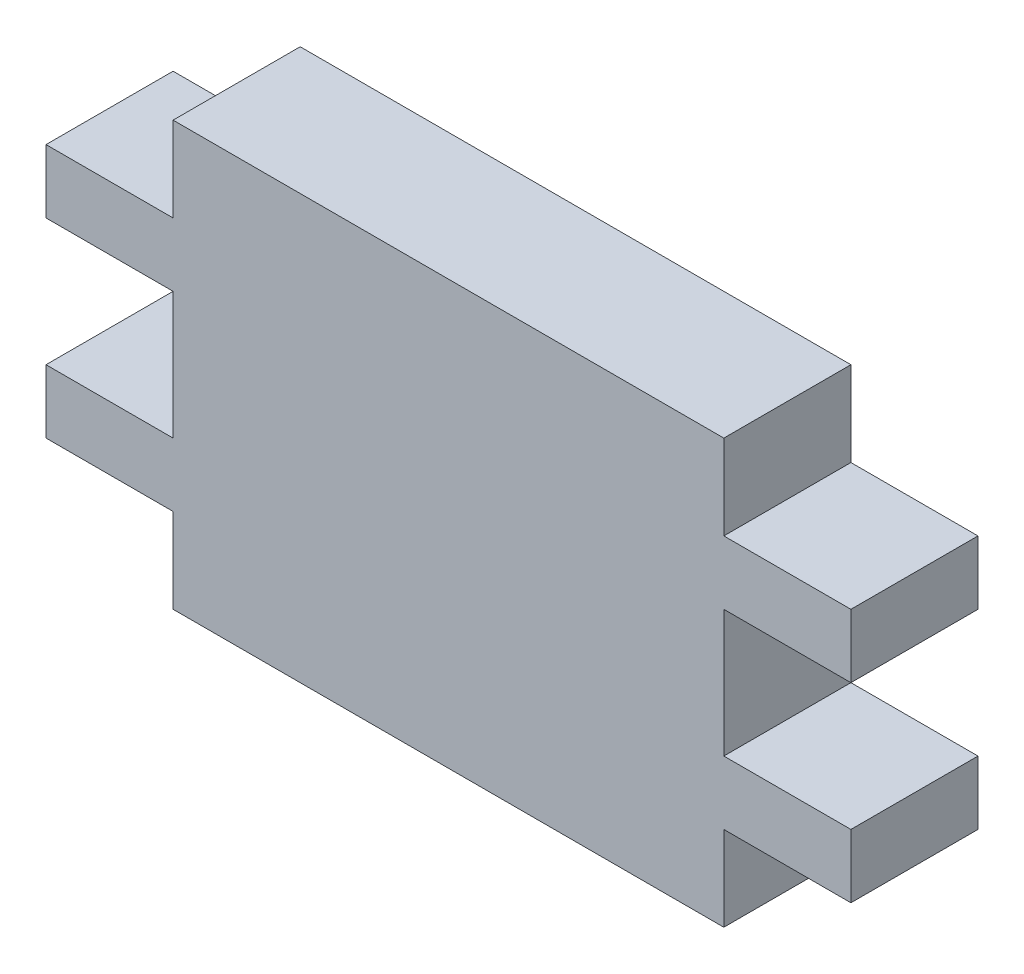
ISO-10303-21;
HEADER;
FILE_DESCRIPTION(('STEP AP214'),'2;1');
FILE_NAME('part.step','',(''),(''),'','','');
FILE_SCHEMA(('AUTOMOTIVE_DESIGN { 1 0 10303 214 1 1 1 1 }'));
ENDSEC;
DATA;
#1=APPLICATION_CONTEXT('core data for automotive mechanical design processes');
#2=APPLICATION_PROTOCOL_DEFINITION('international standard','automotive_design',2000,#1);
#3=PRODUCT_CONTEXT('',#1,'mechanical');
#4=PRODUCT('Part','Part','',(#3));
#5=PRODUCT_RELATED_PRODUCT_CATEGORY('part','',(#4));
#6=PRODUCT_DEFINITION_FORMATION('','',#4);
#7=PRODUCT_DEFINITION_CONTEXT('part definition',#1,'design');
#8=PRODUCT_DEFINITION('design','',#6,#7);
#9=PRODUCT_DEFINITION_SHAPE('','',#8);
#10=(LENGTH_UNIT() NAMED_UNIT(*) SI_UNIT(.MILLI.,.METRE.));
#11=(NAMED_UNIT(*) PLANE_ANGLE_UNIT() SI_UNIT($,.RADIAN.));
#12=(NAMED_UNIT(*) SI_UNIT($,.STERADIAN.) SOLID_ANGLE_UNIT());
#13=UNCERTAINTY_MEASURE_WITH_UNIT(LENGTH_MEASURE(1.E-05),#10,'distance_accuracy_value','');
#14=(GEOMETRIC_REPRESENTATION_CONTEXT(3) GLOBAL_UNCERTAINTY_ASSIGNED_CONTEXT((#13)) GLOBAL_UNIT_ASSIGNED_CONTEXT((#10,
#11,#12)) REPRESENTATION_CONTEXT('',''));
#15=CARTESIAN_POINT('',(0.,0.,0.));
#16=DIRECTION('',(0.,0.,1.));
#17=DIRECTION('',(1.,0.,0.));
#18=AXIS2_PLACEMENT_3D('',#15,#16,#17);
#19=CARTESIAN_POINT('',(9.5,-5.,3.));
#20=DIRECTION('',(-1.,0.,0.));
#21=DIRECTION('',(0.,0.,1.));
#22=AXIS2_PLACEMENT_3D('',#19,#20,#21);
#23=PLANE('',#22);
#24=DIRECTION('',(0.,1.,0.));
#25=VECTOR('',#24,1.);
#26=CARTESIAN_POINT('',(9.5,-5.,0.));
#27=LINE('',#26,#25);
#28=CARTESIAN_POINT('',(9.5,-3.,0.));
#29=VERTEX_POINT('',#28);
#30=CARTESIAN_POINT('',(9.5,-1.5,0.));
#31=VERTEX_POINT('',#30);
#32=EDGE_CURVE('E322',#29,#31,#27,.T.);
#33=ORIENTED_EDGE('',*,*,#32,.T.);
#34=DIRECTION('',(0.,0.,1.));
#35=VECTOR('',#34,1.);
#36=CARTESIAN_POINT('',(9.5,-1.5,0.));
#37=LINE('',#36,#35);
#38=CARTESIAN_POINT('',(9.5,-1.5,3.));
#39=VERTEX_POINT('',#38);
#40=EDGE_CURVE('E218',#31,#39,#37,.T.);
#41=ORIENTED_EDGE('',*,*,#40,.T.);
#42=DIRECTION('',(0.,1.,0.));
#43=VECTOR('',#42,1.);
#44=CARTESIAN_POINT('',(9.5,-5.,3.));
#45=LINE('',#44,#43);
#46=CARTESIAN_POINT('',(9.5,-3.,3.));
#47=VERTEX_POINT('',#46);
#48=EDGE_CURVE('E315',#47,#39,#45,.T.);
#49=ORIENTED_EDGE('',*,*,#48,.F.);
#50=DIRECTION('',(0.,0.,1.));
#51=VECTOR('',#50,1.);
#52=CARTESIAN_POINT('',(9.5,-3.,0.));
#53=LINE('',#52,#51);
#54=EDGE_CURVE('E235',#29,#47,#53,.T.);
#55=ORIENTED_EDGE('',*,*,#54,.F.);
#56=EDGE_LOOP('',(#33,#41,#49,#55));
#57=FACE_BOUND('',#56,.T.);
#58=ADVANCED_FACE('F39',(#57),#23,.F.);
#59=CARTESIAN_POINT('',(-9.5,-5.,3.));
#60=DIRECTION('',(1.,0.,0.));
#61=DIRECTION('',(0.,0.,-1.));
#62=AXIS2_PLACEMENT_3D('',#59,#60,#61);
#63=PLANE('',#62);
#64=DIRECTION('',(0.,-1.,0.));
#65=VECTOR('',#64,1.);
#66=CARTESIAN_POINT('',(-9.5,-5.,3.));
#67=LINE('',#66,#65);
#68=CARTESIAN_POINT('',(-9.5,3.,3.));
#69=VERTEX_POINT('',#68);
#70=CARTESIAN_POINT('',(-9.5,1.5,3.));
#71=VERTEX_POINT('',#70);
#72=EDGE_CURVE('E48',#69,#71,#67,.T.);
#73=ORIENTED_EDGE('',*,*,#72,.F.);
#74=DIRECTION('',(0.,0.,1.));
#75=VECTOR('',#74,1.);
#76=CARTESIAN_POINT('',(-9.5,3.,0.));
#77=LINE('',#76,#75);
#78=CARTESIAN_POINT('',(-9.5,3.,0.));
#79=VERTEX_POINT('',#78);
#80=EDGE_CURVE('E256',#79,#69,#77,.T.);
#81=ORIENTED_EDGE('',*,*,#80,.F.);
#82=DIRECTION('',(0.,-1.,0.));
#83=VECTOR('',#82,1.);
#84=CARTESIAN_POINT('',(-9.5,-5.,0.));
#85=LINE('',#84,#83);
#86=CARTESIAN_POINT('',(-9.5,1.5,0.));
#87=VERTEX_POINT('',#86);
#88=EDGE_CURVE('E325',#79,#87,#85,.T.);
#89=ORIENTED_EDGE('',*,*,#88,.T.);
#90=DIRECTION('',(0.,0.,1.));
#91=VECTOR('',#90,1.);
#92=CARTESIAN_POINT('',(-9.5,1.5,0.));
#93=LINE('',#92,#91);
#94=EDGE_CURVE('E277',#87,#71,#93,.T.);
#95=ORIENTED_EDGE('',*,*,#94,.T.);
#96=EDGE_LOOP('',(#73,#81,#89,#95));
#97=FACE_BOUND('',#96,.T.);
#98=ADVANCED_FACE('F370',(#97),#63,.F.);
#99=CARTESIAN_POINT('',(9.5,1.5,0.));
#100=VERTEX_POINT('',#99);
#101=CARTESIAN_POINT('',(9.5,3.,0.));
#102=VERTEX_POINT('',#101);
#103=EDGE_CURVE('E266',#100,#102,#27,.T.);
#104=ORIENTED_EDGE('',*,*,#103,.T.);
#105=DIRECTION('',(0.,0.,1.));
#106=VECTOR('',#105,1.);
#107=CARTESIAN_POINT('',(9.5,3.,0.));
#108=LINE('',#107,#106);
#109=CARTESIAN_POINT('',(9.5,3.,3.));
#110=VERTEX_POINT('',#109);
#111=EDGE_CURVE('E187',#102,#110,#108,.T.);
#112=ORIENTED_EDGE('',*,*,#111,.T.);
#113=CARTESIAN_POINT('',(9.5,1.5,3.));
#114=VERTEX_POINT('',#113);
#115=EDGE_CURVE('E312',#114,#110,#45,.T.);
#116=ORIENTED_EDGE('',*,*,#115,.F.);
#117=DIRECTION('',(0.,0.,1.));
#118=VECTOR('',#117,1.);
#119=CARTESIAN_POINT('',(9.5,1.5,0.));
#120=LINE('',#119,#118);
#121=EDGE_CURVE('E211',#100,#114,#120,.T.);
#122=ORIENTED_EDGE('',*,*,#121,.F.);
#123=EDGE_LOOP('',(#104,#112,#116,#122));
#124=FACE_BOUND('',#123,.T.);
#125=ADVANCED_FACE('F41',(#124),#23,.F.);
#126=CARTESIAN_POINT('',(-9.5,5.,3.));
#127=DIRECTION('',(0.,-1.,0.));
#128=DIRECTION('',(0.,0.,-1.));
#129=AXIS2_PLACEMENT_3D('',#126,#127,#128);
#130=PLANE('',#129);
#131=DIRECTION('',(-1.,0.,0.));
#132=VECTOR('',#131,1.);
#133=CARTESIAN_POINT('',(-9.5,5.,3.));
#134=LINE('',#133,#132);
#135=CARTESIAN_POINT('',(6.5,5.,3.));
#136=VERTEX_POINT('',#135);
#137=CARTESIAN_POINT('',(-6.5,5.,3.));
#138=VERTEX_POINT('',#137);
#139=EDGE_CURVE('E316',#136,#138,#134,.T.);
#140=ORIENTED_EDGE('',*,*,#139,.F.);
#141=DIRECTION('',(0.,0.,1.));
#142=VECTOR('',#141,1.);
#143=CARTESIAN_POINT('',(6.5,5.,0.));
#144=LINE('',#143,#142);
#145=CARTESIAN_POINT('',(6.5,5.,0.));
#146=VERTEX_POINT('',#145);
#147=EDGE_CURVE('E207',#146,#136,#144,.T.);
#148=ORIENTED_EDGE('',*,*,#147,.F.);
#149=DIRECTION('',(-1.,0.,0.));
#150=VECTOR('',#149,1.);
#151=CARTESIAN_POINT('',(-9.5,5.,0.));
#152=LINE('',#151,#150);
#153=CARTESIAN_POINT('',(-6.5,5.,0.));
#154=VERTEX_POINT('',#153);
#155=EDGE_CURVE('E200',#146,#154,#152,.T.);
#156=ORIENTED_EDGE('',*,*,#155,.T.);
#157=DIRECTION('',(0.,0.,1.));
#158=VECTOR('',#157,1.);
#159=CARTESIAN_POINT('',(-6.5,5.,0.));
#160=LINE('',#159,#158);
#161=EDGE_CURVE('E263',#154,#138,#160,.T.);
#162=ORIENTED_EDGE('',*,*,#161,.T.);
#163=EDGE_LOOP('',(#140,#148,#156,#162));
#164=FACE_BOUND('',#163,.T.);
#165=ADVANCED_FACE('F377',(#164),#130,.F.);
#166=CARTESIAN_POINT('',(-9.5,-1.5,3.));
#167=VERTEX_POINT('',#166);
#168=CARTESIAN_POINT('',(-9.5,-3.,3.));
#169=VERTEX_POINT('',#168);
#170=EDGE_CURVE('E318',#167,#169,#67,.T.);
#171=ORIENTED_EDGE('',*,*,#170,.F.);
#172=DIRECTION('',(0.,0.,1.));
#173=VECTOR('',#172,1.);
#174=CARTESIAN_POINT('',(-9.5,-1.5,0.));
#175=LINE('',#174,#173);
#176=CARTESIAN_POINT('',(-9.5,-1.5,0.));
#177=VERTEX_POINT('',#176);
#178=EDGE_CURVE('E270',#177,#167,#175,.T.);
#179=ORIENTED_EDGE('',*,*,#178,.F.);
#180=CARTESIAN_POINT('',(-9.5,-3.,0.));
#181=VERTEX_POINT('',#180);
#182=EDGE_CURVE('E323',#177,#181,#85,.T.);
#183=ORIENTED_EDGE('',*,*,#182,.T.);
#184=DIRECTION('',(0.,0.,1.));
#185=VECTOR('',#184,1.);
#186=CARTESIAN_POINT('',(-9.5,-3.,0.));
#187=LINE('',#186,#185);
#188=EDGE_CURVE('E209',#181,#169,#187,.T.);
#189=ORIENTED_EDGE('',*,*,#188,.T.);
#190=EDGE_LOOP('',(#171,#179,#183,#189));
#191=FACE_BOUND('',#190,.T.);
#192=ADVANCED_FACE('F376',(#191),#63,.F.);
#193=CARTESIAN_POINT('',(-9.5,-5.,3.));
#194=DIRECTION('',(0.,1.,0.));
#195=DIRECTION('',(0.,0.,1.));
#196=AXIS2_PLACEMENT_3D('',#193,#194,#195);
#197=PLANE('',#196);
#198=DIRECTION('',(1.,0.,0.));
#199=VECTOR('',#198,1.);
#200=CARTESIAN_POINT('',(-9.5,-5.,0.));
#201=LINE('',#200,#199);
#202=CARTESIAN_POINT('',(-6.5,-5.,0.));
#203=VERTEX_POINT('',#202);
#204=CARTESIAN_POINT('',(6.5,-5.,0.));
#205=VERTEX_POINT('',#204);
#206=EDGE_CURVE('E43',#203,#205,#201,.T.);
#207=ORIENTED_EDGE('',*,*,#206,.T.);
#208=DIRECTION('',(0.,0.,1.));
#209=VECTOR('',#208,1.);
#210=CARTESIAN_POINT('',(6.5,-5.,0.));
#211=LINE('',#210,#209);
#212=CARTESIAN_POINT('',(6.5,-5.,3.));
#213=VERTEX_POINT('',#212);
#214=EDGE_CURVE('E239',#205,#213,#211,.T.);
#215=ORIENTED_EDGE('',*,*,#214,.T.);
#216=DIRECTION('',(1.,0.,0.));
#217=VECTOR('',#216,1.);
#218=CARTESIAN_POINT('',(-9.5,-5.,3.));
#219=LINE('',#218,#217);
#220=CARTESIAN_POINT('',(-6.5,-5.,3.));
#221=VERTEX_POINT('',#220);
#222=EDGE_CURVE('E11',#221,#213,#219,.T.);
#223=ORIENTED_EDGE('',*,*,#222,.F.);
#224=DIRECTION('',(0.,0.,1.));
#225=VECTOR('',#224,1.);
#226=CARTESIAN_POINT('',(-6.5,-5.,0.));
#227=LINE('',#226,#225);
#228=EDGE_CURVE('E296',#203,#221,#227,.T.);
#229=ORIENTED_EDGE('',*,*,#228,.F.);
#230=EDGE_LOOP('',(#207,#215,#223,#229));
#231=FACE_BOUND('',#230,.T.);
#232=ADVANCED_FACE('F337',(#231),#197,.F.);
#233=CARTESIAN_POINT('',(0.,0.,3.));
#234=DIRECTION('',(0.,0.,-1.));
#235=DIRECTION('',(-1.,0.,0.));
#236=AXIS2_PLACEMENT_3D('',#233,#234,#235);
#237=PLANE('',#236);
#238=DIRECTION('',(1.,0.,0.));
#239=VECTOR('',#238,1.);
#240=CARTESIAN_POINT('',(6.5,3.,3.));
#241=LINE('',#240,#239);
#242=CARTESIAN_POINT('',(6.5,3.,3.));
#243=VERTEX_POINT('',#242);
#244=EDGE_CURVE('E201',#243,#110,#241,.T.);
#245=ORIENTED_EDGE('',*,*,#244,.F.);
#246=DIRECTION('',(0.,-1.,0.));
#247=VECTOR('',#246,1.);
#248=CARTESIAN_POINT('',(6.5,5.,3.));
#249=LINE('',#248,#247);
#250=EDGE_CURVE('E184',#136,#243,#249,.T.);
#251=ORIENTED_EDGE('',*,*,#250,.F.);
#252=ORIENTED_EDGE('',*,*,#139,.T.);
#253=DIRECTION('',(0.,1.,0.));
#254=VECTOR('',#253,1.);
#255=CARTESIAN_POINT('',(-6.5,3.,3.));
#256=LINE('',#255,#254);
#257=CARTESIAN_POINT('',(-6.5,3.,3.));
#258=VERTEX_POINT('',#257);
#259=EDGE_CURVE('E254',#258,#138,#256,.T.);
#260=ORIENTED_EDGE('',*,*,#259,.F.);
#261=DIRECTION('',(1.,0.,0.));
#262=VECTOR('',#261,1.);
#263=CARTESIAN_POINT('',(-9.5,3.,3.));
#264=LINE('',#263,#262);
#265=EDGE_CURVE('E257',#69,#258,#264,.T.);
#266=ORIENTED_EDGE('',*,*,#265,.F.);
#267=ORIENTED_EDGE('',*,*,#72,.T.);
#268=DIRECTION('',(-1.,0.,0.));
#269=VECTOR('',#268,1.);
#270=CARTESIAN_POINT('',(-9.5,1.5,3.));
#271=LINE('',#270,#269);
#272=CARTESIAN_POINT('',(-6.5,1.5,3.));
#273=VERTEX_POINT('',#272);
#274=EDGE_CURVE('E281',#273,#71,#271,.T.);
#275=ORIENTED_EDGE('',*,*,#274,.F.);
#276=DIRECTION('',(0.,1.,0.));
#277=VECTOR('',#276,1.);
#278=CARTESIAN_POINT('',(-6.5,1.5,3.));
#279=LINE('',#278,#277);
#280=CARTESIAN_POINT('',(-6.5,-1.5,3.));
#281=VERTEX_POINT('',#280);
#282=EDGE_CURVE('E283',#281,#273,#279,.T.);
#283=ORIENTED_EDGE('',*,*,#282,.F.);
#284=DIRECTION('',(1.,0.,0.));
#285=VECTOR('',#284,1.);
#286=CARTESIAN_POINT('',(-9.5,-1.5,3.));
#287=LINE('',#286,#285);
#288=EDGE_CURVE('E260',#167,#281,#287,.T.);
#289=ORIENTED_EDGE('',*,*,#288,.F.);
#290=ORIENTED_EDGE('',*,*,#170,.T.);
#291=DIRECTION('',(-1.,0.,0.));
#292=VECTOR('',#291,1.);
#293=CARTESIAN_POINT('',(-9.5,-3.,3.));
#294=LINE('',#293,#292);
#295=CARTESIAN_POINT('',(-6.5,-3.,3.));
#296=VERTEX_POINT('',#295);
#297=EDGE_CURVE('E303',#296,#169,#294,.T.);
#298=ORIENTED_EDGE('',*,*,#297,.F.);
#299=DIRECTION('',(0.,1.,0.));
#300=VECTOR('',#299,1.);
#301=CARTESIAN_POINT('',(-6.5,-3.,3.));
#302=LINE('',#301,#300);
#303=EDGE_CURVE('E280',#221,#296,#302,.T.);
#304=ORIENTED_EDGE('',*,*,#303,.F.);
#305=ORIENTED_EDGE('',*,*,#222,.T.);
#306=DIRECTION('',(0.,-1.,0.));
#307=VECTOR('',#306,1.);
#308=CARTESIAN_POINT('',(6.5,-3.,3.));
#309=LINE('',#308,#307);
#310=CARTESIAN_POINT('',(6.5,-3.,3.));
#311=VERTEX_POINT('',#310);
#312=EDGE_CURVE('E242',#311,#213,#309,.T.);
#313=ORIENTED_EDGE('',*,*,#312,.F.);
#314=DIRECTION('',(-1.,0.,0.));
#315=VECTOR('',#314,1.);
#316=CARTESIAN_POINT('',(9.5,-3.,3.));
#317=LINE('',#316,#315);
#318=EDGE_CURVE('E221',#47,#311,#317,.T.);
#319=ORIENTED_EDGE('',*,*,#318,.F.);
#320=ORIENTED_EDGE('',*,*,#48,.T.);
#321=DIRECTION('',(1.,0.,0.));
#322=VECTOR('',#321,1.);
#323=CARTESIAN_POINT('',(9.5,-1.5,3.));
#324=LINE('',#323,#322);
#325=CARTESIAN_POINT('',(6.5,-1.5,3.));
#326=VERTEX_POINT('',#325);
#327=EDGE_CURVE('E222',#326,#39,#324,.T.);
#328=ORIENTED_EDGE('',*,*,#327,.F.);
#329=DIRECTION('',(0.,-1.,0.));
#330=VECTOR('',#329,1.);
#331=CARTESIAN_POINT('',(6.5,1.5,3.));
#332=LINE('',#331,#330);
#333=CARTESIAN_POINT('',(6.5,1.5,3.));
#334=VERTEX_POINT('',#333);
#335=EDGE_CURVE('E224',#334,#326,#332,.T.);
#336=ORIENTED_EDGE('',*,*,#335,.F.);
#337=DIRECTION('',(-1.,0.,0.));
#338=VECTOR('',#337,1.);
#339=CARTESIAN_POINT('',(9.5,1.5,3.));
#340=LINE('',#339,#338);
#341=EDGE_CURVE('E205',#114,#334,#340,.T.);
#342=ORIENTED_EDGE('',*,*,#341,.F.);
#343=ORIENTED_EDGE('',*,*,#115,.T.);
#344=EDGE_LOOP('',(#245,#251,#252,#260,#266,#267,#275,#283,#289,#290,#298,#304,#305,#313,#319,
#320,#328,#336,#342,#343));
#345=FACE_BOUND('',#344,.T.);
#346=ADVANCED_FACE('F350',(#345),#237,.F.);
#347=CARTESIAN_POINT('',(0.,0.,0.));
#348=DIRECTION('',(0.,0.,-1.));
#349=DIRECTION('',(-1.,0.,0.));
#350=AXIS2_PLACEMENT_3D('',#347,#348,#349);
#351=PLANE('',#350);
#352=DIRECTION('',(0.,-1.,0.));
#353=VECTOR('',#352,1.);
#354=CARTESIAN_POINT('',(6.5,5.,0.));
#355=LINE('',#354,#353);
#356=CARTESIAN_POINT('',(6.5,3.,0.));
#357=VERTEX_POINT('',#356);
#358=EDGE_CURVE('E181',#146,#357,#355,.T.);
#359=ORIENTED_EDGE('',*,*,#358,.T.);
#360=DIRECTION('',(1.,0.,0.));
#361=VECTOR('',#360,1.);
#362=CARTESIAN_POINT('',(6.5,3.,0.));
#363=LINE('',#362,#361);
#364=EDGE_CURVE('E188',#357,#102,#363,.T.);
#365=ORIENTED_EDGE('',*,*,#364,.T.);
#366=ORIENTED_EDGE('',*,*,#103,.F.);
#367=DIRECTION('',(-1.,0.,0.));
#368=VECTOR('',#367,1.);
#369=CARTESIAN_POINT('',(9.5,1.5,0.));
#370=LINE('',#369,#368);
#371=CARTESIAN_POINT('',(6.5,1.5,0.));
#372=VERTEX_POINT('',#371);
#373=EDGE_CURVE('E225',#100,#372,#370,.T.);
#374=ORIENTED_EDGE('',*,*,#373,.T.);
#375=DIRECTION('',(0.,-1.,0.));
#376=VECTOR('',#375,1.);
#377=CARTESIAN_POINT('',(6.5,1.5,0.));
#378=LINE('',#377,#376);
#379=CARTESIAN_POINT('',(6.5,-1.5,0.));
#380=VERTEX_POINT('',#379);
#381=EDGE_CURVE('E56',#372,#380,#378,.T.);
#382=ORIENTED_EDGE('',*,*,#381,.T.);
#383=DIRECTION('',(1.,0.,0.));
#384=VECTOR('',#383,1.);
#385=CARTESIAN_POINT('',(9.5,-1.5,0.));
#386=LINE('',#385,#384);
#387=EDGE_CURVE('E213',#380,#31,#386,.T.);
#388=ORIENTED_EDGE('',*,*,#387,.T.);
#389=ORIENTED_EDGE('',*,*,#32,.F.);
#390=DIRECTION('',(-1.,0.,0.));
#391=VECTOR('',#390,1.);
#392=CARTESIAN_POINT('',(9.5,-3.,0.));
#393=LINE('',#392,#391);
#394=CARTESIAN_POINT('',(6.5,-3.,0.));
#395=VERTEX_POINT('',#394);
#396=EDGE_CURVE('E244',#29,#395,#393,.T.);
#397=ORIENTED_EDGE('',*,*,#396,.T.);
#398=DIRECTION('',(0.,-1.,0.));
#399=VECTOR('',#398,1.);
#400=CARTESIAN_POINT('',(6.5,-3.,0.));
#401=LINE('',#400,#399);
#402=EDGE_CURVE('E64',#395,#205,#401,.T.);
#403=ORIENTED_EDGE('',*,*,#402,.T.);
#404=ORIENTED_EDGE('',*,*,#206,.F.);
#405=DIRECTION('',(0.,1.,0.));
#406=VECTOR('',#405,1.);
#407=CARTESIAN_POINT('',(-6.5,-3.,0.));
#408=LINE('',#407,#406);
#409=CARTESIAN_POINT('',(-6.5,-3.,0.));
#410=VERTEX_POINT('',#409);
#411=EDGE_CURVE('E305',#203,#410,#408,.T.);
#412=ORIENTED_EDGE('',*,*,#411,.T.);
#413=DIRECTION('',(-1.,0.,0.));
#414=VECTOR('',#413,1.);
#415=CARTESIAN_POINT('',(-9.5,-3.,0.));
#416=LINE('',#415,#414);
#417=EDGE_CURVE('E298',#410,#181,#416,.T.);
#418=ORIENTED_EDGE('',*,*,#417,.T.);
#419=ORIENTED_EDGE('',*,*,#182,.F.);
#420=DIRECTION('',(1.,0.,0.));
#421=VECTOR('',#420,1.);
#422=CARTESIAN_POINT('',(-9.5,-1.5,0.));
#423=LINE('',#422,#421);
#424=CARTESIAN_POINT('',(-6.5,-1.5,0.));
#425=VERTEX_POINT('',#424);
#426=EDGE_CURVE('E284',#177,#425,#423,.T.);
#427=ORIENTED_EDGE('',*,*,#426,.T.);
#428=DIRECTION('',(0.,1.,0.));
#429=VECTOR('',#428,1.);
#430=CARTESIAN_POINT('',(-6.5,1.5,0.));
#431=LINE('',#430,#429);
#432=CARTESIAN_POINT('',(-6.5,1.5,0.));
#433=VERTEX_POINT('',#432);
#434=EDGE_CURVE('E291',#425,#433,#431,.T.);
#435=ORIENTED_EDGE('',*,*,#434,.T.);
#436=DIRECTION('',(-1.,0.,0.));
#437=VECTOR('',#436,1.);
#438=CARTESIAN_POINT('',(-9.5,1.5,0.));
#439=LINE('',#438,#437);
#440=EDGE_CURVE('E272',#433,#87,#439,.T.);
#441=ORIENTED_EDGE('',*,*,#440,.T.);
#442=ORIENTED_EDGE('',*,*,#88,.F.);
#443=DIRECTION('',(1.,0.,0.));
#444=VECTOR('',#443,1.);
#445=CARTESIAN_POINT('',(-9.5,3.,0.));
#446=LINE('',#445,#444);
#447=CARTESIAN_POINT('',(-6.5,3.,0.));
#448=VERTEX_POINT('',#447);
#449=EDGE_CURVE('E250',#79,#448,#446,.T.);
#450=ORIENTED_EDGE('',*,*,#449,.T.);
#451=DIRECTION('',(0.,1.,0.));
#452=VECTOR('',#451,1.);
#453=CARTESIAN_POINT('',(-6.5,3.,0.));
#454=LINE('',#453,#452);
#455=EDGE_CURVE('E253',#448,#154,#454,.T.);
#456=ORIENTED_EDGE('',*,*,#455,.T.);
#457=ORIENTED_EDGE('',*,*,#155,.F.);
#458=EDGE_LOOP('',(#359,#365,#366,#374,#382,#388,#389,#397,#403,#404,#412,#418,#419,#427,#435,
#441,#442,#450,#456,#457));
#459=FACE_BOUND('',#458,.T.);
#460=ADVANCED_FACE('F198',(#459),#351,.T.);
#461=CARTESIAN_POINT('',(-9.5,-3.,0.));
#462=DIRECTION('',(0.,1.,0.));
#463=DIRECTION('',(0.,0.,1.));
#464=AXIS2_PLACEMENT_3D('',#461,#462,#463);
#465=PLANE('',#464);
#466=ORIENTED_EDGE('',*,*,#297,.T.);
#467=ORIENTED_EDGE('',*,*,#188,.F.);
#468=ORIENTED_EDGE('',*,*,#417,.F.);
#469=DIRECTION('',(0.,0.,1.));
#470=VECTOR('',#469,1.);
#471=CARTESIAN_POINT('',(-6.5,-3.,0.));
#472=LINE('',#471,#470);
#473=EDGE_CURVE('E299',#410,#296,#472,.T.);
#474=ORIENTED_EDGE('',*,*,#473,.T.);
#475=EDGE_LOOP('',(#466,#467,#468,#474));
#476=FACE_BOUND('',#475,.T.);
#477=ADVANCED_FACE('F412',(#476),#465,.F.);
#478=CARTESIAN_POINT('',(-6.5,-3.,0.));
#479=DIRECTION('',(1.,0.,0.));
#480=DIRECTION('',(0.,1.,0.));
#481=AXIS2_PLACEMENT_3D('',#478,#479,#480);
#482=PLANE('',#481);
#483=ORIENTED_EDGE('',*,*,#303,.T.);
#484=ORIENTED_EDGE('',*,*,#473,.F.);
#485=ORIENTED_EDGE('',*,*,#411,.F.);
#486=ORIENTED_EDGE('',*,*,#228,.T.);
#487=EDGE_LOOP('',(#483,#484,#485,#486));
#488=FACE_BOUND('',#487,.T.);
#489=ADVANCED_FACE('F415',(#488),#482,.F.);
#490=CARTESIAN_POINT('',(-9.5,1.5,0.));
#491=DIRECTION('',(0.,1.,0.));
#492=DIRECTION('',(0.,0.,1.));
#493=AXIS2_PLACEMENT_3D('',#490,#491,#492);
#494=PLANE('',#493);
#495=ORIENTED_EDGE('',*,*,#274,.T.);
#496=ORIENTED_EDGE('',*,*,#94,.F.);
#497=ORIENTED_EDGE('',*,*,#440,.F.);
#498=DIRECTION('',(0.,0.,1.));
#499=VECTOR('',#498,1.);
#500=CARTESIAN_POINT('',(-6.5,1.5,0.));
#501=LINE('',#500,#499);
#502=EDGE_CURVE('E275',#433,#273,#501,.T.);
#503=ORIENTED_EDGE('',*,*,#502,.T.);
#504=EDGE_LOOP('',(#495,#496,#497,#503));
#505=FACE_BOUND('',#504,.T.);
#506=ADVANCED_FACE('F402',(#505),#494,.F.);
#507=CARTESIAN_POINT('',(-6.5,1.5,0.));
#508=DIRECTION('',(1.,0.,0.));
#509=DIRECTION('',(0.,0.,-1.));
#510=AXIS2_PLACEMENT_3D('',#507,#508,#509);
#511=PLANE('',#510);
#512=ORIENTED_EDGE('',*,*,#282,.T.);
#513=ORIENTED_EDGE('',*,*,#502,.F.);
#514=ORIENTED_EDGE('',*,*,#434,.F.);
#515=DIRECTION('',(0.,0.,1.));
#516=VECTOR('',#515,1.);
#517=CARTESIAN_POINT('',(-6.5,-1.5,0.));
#518=LINE('',#517,#516);
#519=EDGE_CURVE('E273',#425,#281,#518,.T.);
#520=ORIENTED_EDGE('',*,*,#519,.T.);
#521=EDGE_LOOP('',(#512,#513,#514,#520));
#522=FACE_BOUND('',#521,.T.);
#523=ADVANCED_FACE('F405',(#522),#511,.F.);
#524=CARTESIAN_POINT('',(-9.5,-1.5,0.));
#525=DIRECTION('',(0.,-1.,0.));
#526=DIRECTION('',(0.,0.,-1.));
#527=AXIS2_PLACEMENT_3D('',#524,#525,#526);
#528=PLANE('',#527);
#529=ORIENTED_EDGE('',*,*,#288,.T.);
#530=ORIENTED_EDGE('',*,*,#519,.F.);
#531=ORIENTED_EDGE('',*,*,#426,.F.);
#532=ORIENTED_EDGE('',*,*,#178,.T.);
#533=EDGE_LOOP('',(#529,#530,#531,#532));
#534=FACE_BOUND('',#533,.T.);
#535=ADVANCED_FACE('F408',(#534),#528,.F.);
#536=CARTESIAN_POINT('',(-6.5,3.,0.));
#537=DIRECTION('',(1.,0.,0.));
#538=DIRECTION('',(0.,0.,-1.));
#539=AXIS2_PLACEMENT_3D('',#536,#537,#538);
#540=PLANE('',#539);
#541=ORIENTED_EDGE('',*,*,#259,.T.);
#542=ORIENTED_EDGE('',*,*,#161,.F.);
#543=ORIENTED_EDGE('',*,*,#455,.F.);
#544=DIRECTION('',(0.,0.,1.));
#545=VECTOR('',#544,1.);
#546=CARTESIAN_POINT('',(-6.5,3.,0.));
#547=LINE('',#546,#545);
#548=EDGE_CURVE('E267',#448,#258,#547,.T.);
#549=ORIENTED_EDGE('',*,*,#548,.T.);
#550=EDGE_LOOP('',(#541,#542,#543,#549));
#551=FACE_BOUND('',#550,.T.);
#552=ADVANCED_FACE('F365',(#551),#540,.F.);
#553=CARTESIAN_POINT('',(-9.5,3.,0.));
#554=DIRECTION('',(0.,-1.,0.));
#555=DIRECTION('',(0.,0.,-1.));
#556=AXIS2_PLACEMENT_3D('',#553,#554,#555);
#557=PLANE('',#556);
#558=ORIENTED_EDGE('',*,*,#265,.T.);
#559=ORIENTED_EDGE('',*,*,#548,.F.);
#560=ORIENTED_EDGE('',*,*,#449,.F.);
#561=ORIENTED_EDGE('',*,*,#80,.T.);
#562=EDGE_LOOP('',(#558,#559,#560,#561));
#563=FACE_BOUND('',#562,.T.);
#564=ADVANCED_FACE('F356',(#563),#557,.F.);
#565=CARTESIAN_POINT('',(6.5,-3.,0.));
#566=DIRECTION('',(-1.,0.,0.));
#567=DIRECTION('',(0.,0.,1.));
#568=AXIS2_PLACEMENT_3D('',#565,#566,#567);
#569=PLANE('',#568);
#570=ORIENTED_EDGE('',*,*,#312,.T.);
#571=ORIENTED_EDGE('',*,*,#214,.F.);
#572=ORIENTED_EDGE('',*,*,#402,.F.);
#573=DIRECTION('',(0.,0.,1.));
#574=VECTOR('',#573,1.);
#575=CARTESIAN_POINT('',(6.5,-3.,0.));
#576=LINE('',#575,#574);
#577=EDGE_CURVE('E237',#395,#311,#576,.T.);
#578=ORIENTED_EDGE('',*,*,#577,.T.);
#579=EDGE_LOOP('',(#570,#571,#572,#578));
#580=FACE_BOUND('',#579,.T.);
#581=ADVANCED_FACE('F354',(#580),#569,.F.);
#582=CARTESIAN_POINT('',(9.5,-3.,0.));
#583=DIRECTION('',(0.,1.,0.));
#584=DIRECTION('',(-1.,0.,0.));
#585=AXIS2_PLACEMENT_3D('',#582,#583,#584);
#586=PLANE('',#585);
#587=ORIENTED_EDGE('',*,*,#318,.T.);
#588=ORIENTED_EDGE('',*,*,#577,.F.);
#589=ORIENTED_EDGE('',*,*,#396,.F.);
#590=ORIENTED_EDGE('',*,*,#54,.T.);
#591=EDGE_LOOP('',(#587,#588,#589,#590));
#592=FACE_BOUND('',#591,.T.);
#593=ADVANCED_FACE('F343',(#592),#586,.F.);
#594=CARTESIAN_POINT('',(9.5,-1.5,0.));
#595=DIRECTION('',(0.,-1.,0.));
#596=DIRECTION('',(1.,0.,0.));
#597=AXIS2_PLACEMENT_3D('',#594,#595,#596);
#598=PLANE('',#597);
#599=ORIENTED_EDGE('',*,*,#327,.T.);
#600=ORIENTED_EDGE('',*,*,#40,.F.);
#601=ORIENTED_EDGE('',*,*,#387,.F.);
#602=DIRECTION('',(0.,0.,1.));
#603=VECTOR('',#602,1.);
#604=CARTESIAN_POINT('',(6.5,-1.5,0.));
#605=LINE('',#604,#603);
#606=EDGE_CURVE('E216',#380,#326,#605,.T.);
#607=ORIENTED_EDGE('',*,*,#606,.T.);
#608=EDGE_LOOP('',(#599,#600,#601,#607));
#609=FACE_BOUND('',#608,.T.);
#610=ADVANCED_FACE('F362',(#609),#598,.F.);
#611=CARTESIAN_POINT('',(6.5,1.5,0.));
#612=DIRECTION('',(-1.,0.,0.));
#613=DIRECTION('',(0.,0.,1.));
#614=AXIS2_PLACEMENT_3D('',#611,#612,#613);
#615=PLANE('',#614);
#616=ORIENTED_EDGE('',*,*,#335,.T.);
#617=ORIENTED_EDGE('',*,*,#606,.F.);
#618=ORIENTED_EDGE('',*,*,#381,.F.);
#619=DIRECTION('',(0.,0.,1.));
#620=VECTOR('',#619,1.);
#621=CARTESIAN_POINT('',(6.5,1.5,0.));
#622=LINE('',#621,#620);
#623=EDGE_CURVE('E214',#372,#334,#622,.T.);
#624=ORIENTED_EDGE('',*,*,#623,.T.);
#625=EDGE_LOOP('',(#616,#617,#618,#624));
#626=FACE_BOUND('',#625,.T.);
#627=ADVANCED_FACE('F388',(#626),#615,.F.);
#628=CARTESIAN_POINT('',(9.5,1.5,0.));
#629=DIRECTION('',(0.,1.,0.));
#630=DIRECTION('',(-1.,0.,0.));
#631=AXIS2_PLACEMENT_3D('',#628,#629,#630);
#632=PLANE('',#631);
#633=ORIENTED_EDGE('',*,*,#341,.T.);
#634=ORIENTED_EDGE('',*,*,#623,.F.);
#635=ORIENTED_EDGE('',*,*,#373,.F.);
#636=ORIENTED_EDGE('',*,*,#121,.T.);
#637=EDGE_LOOP('',(#633,#634,#635,#636));
#638=FACE_BOUND('',#637,.T.);
#639=ADVANCED_FACE('F386',(#638),#632,.F.);
#640=CARTESIAN_POINT('',(6.5,5.,0.));
#641=DIRECTION('',(-1.,0.,0.));
#642=DIRECTION('',(0.,-1.,0.));
#643=AXIS2_PLACEMENT_3D('',#640,#641,#642);
#644=PLANE('',#643);
#645=ORIENTED_EDGE('',*,*,#250,.T.);
#646=DIRECTION('',(0.,0.,1.));
#647=VECTOR('',#646,1.);
#648=CARTESIAN_POINT('',(6.5,3.,0.));
#649=LINE('',#648,#647);
#650=EDGE_CURVE('E177',#357,#243,#649,.T.);
#651=ORIENTED_EDGE('',*,*,#650,.F.);
#652=ORIENTED_EDGE('',*,*,#358,.F.);
#653=ORIENTED_EDGE('',*,*,#147,.T.);
#654=EDGE_LOOP('',(#645,#651,#652,#653));
#655=FACE_BOUND('',#654,.T.);
#656=ADVANCED_FACE('F179',(#655),#644,.F.);
#657=CARTESIAN_POINT('',(6.5,3.,0.));
#658=DIRECTION('',(0.,-1.,0.));
#659=DIRECTION('',(0.,0.,-1.));
#660=AXIS2_PLACEMENT_3D('',#657,#658,#659);
#661=PLANE('',#660);
#662=ORIENTED_EDGE('',*,*,#244,.T.);
#663=ORIENTED_EDGE('',*,*,#111,.F.);
#664=ORIENTED_EDGE('',*,*,#364,.F.);
#665=ORIENTED_EDGE('',*,*,#650,.T.);
#666=EDGE_LOOP('',(#662,#663,#664,#665));
#667=FACE_BOUND('',#666,.T.);
#668=ADVANCED_FACE('F191',(#667),#661,.F.);
#669=CLOSED_SHELL('',(#58,#98,#125,#165,#192,#232,#346,#460,#477,#489,#506,#523,#535,#552,#564,
#581,#593,#610,#627,#639,#656,#668));
#670=MANIFOLD_SOLID_BREP('B2',#669);
#671=ADVANCED_BREP_SHAPE_REPRESENTATION('',(#18,#670),#14);
#672=SHAPE_DEFINITION_REPRESENTATION(#9,#671);
ENDSEC;
END-ISO-10303-21;
